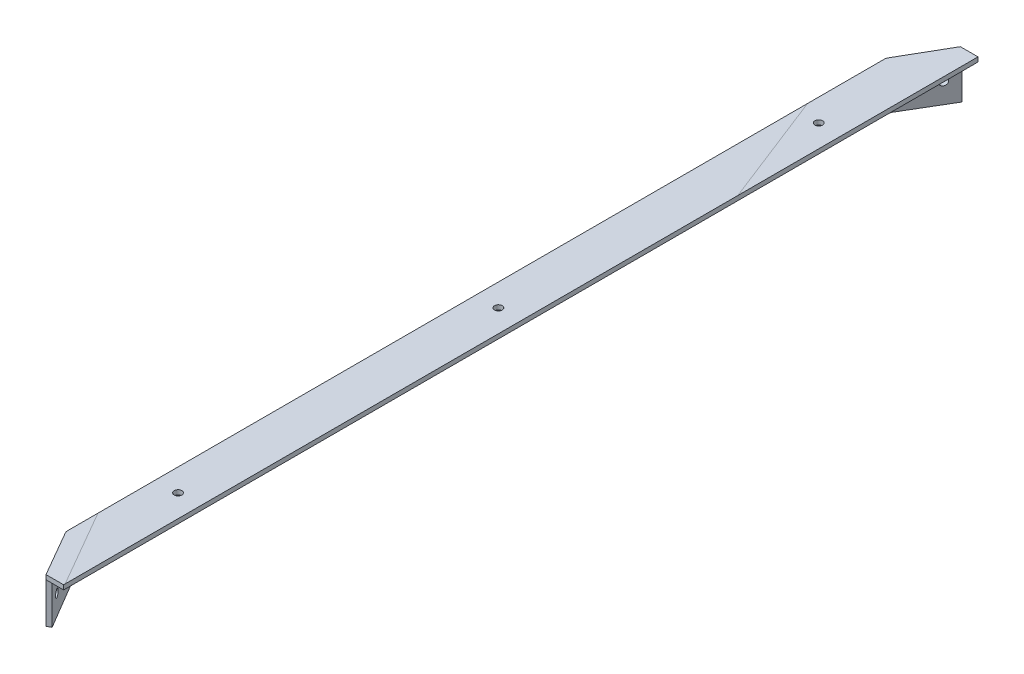
ISO-10303-21;
HEADER;
FILE_DESCRIPTION(('STEP AP214'),'2;1');
FILE_NAME('part.step','',(''),(''),'','','');
FILE_SCHEMA(('AUTOMOTIVE_DESIGN { 1 0 10303 214 1 1 1 1 }'));
ENDSEC;
DATA;
#1=APPLICATION_CONTEXT('core data for automotive mechanical design processes');
#2=APPLICATION_PROTOCOL_DEFINITION('international standard','automotive_design',2000,#1);
#3=PRODUCT_CONTEXT('',#1,'mechanical');
#4=PRODUCT('Part','Part','',(#3));
#5=PRODUCT_RELATED_PRODUCT_CATEGORY('part','',(#4));
#6=PRODUCT_DEFINITION_FORMATION('','',#4);
#7=PRODUCT_DEFINITION_CONTEXT('part definition',#1,'design');
#8=PRODUCT_DEFINITION('design','',#6,#7);
#9=PRODUCT_DEFINITION_SHAPE('','',#8);
#10=(LENGTH_UNIT() NAMED_UNIT(*) SI_UNIT(.MILLI.,.METRE.));
#11=(NAMED_UNIT(*) PLANE_ANGLE_UNIT() SI_UNIT($,.RADIAN.));
#12=(NAMED_UNIT(*) SI_UNIT($,.STERADIAN.) SOLID_ANGLE_UNIT());
#13=UNCERTAINTY_MEASURE_WITH_UNIT(LENGTH_MEASURE(1.E-05),#10,'distance_accuracy_value','');
#14=(GEOMETRIC_REPRESENTATION_CONTEXT(3) GLOBAL_UNCERTAINTY_ASSIGNED_CONTEXT((#13)) GLOBAL_UNIT_ASSIGNED_CONTEXT((#10,
#11,#12)) REPRESENTATION_CONTEXT('',''));
#15=CARTESIAN_POINT('',(0.,0.,0.));
#16=DIRECTION('',(0.,0.,1.));
#17=DIRECTION('',(1.,0.,0.));
#18=AXIS2_PLACEMENT_3D('',#15,#16,#17);
#19=CARTESIAN_POINT('',(0.,70.,640.));
#20=DIRECTION('',(0.,-1.,0.));
#21=DIRECTION('',(0.,0.,-1.));
#22=AXIS2_PLACEMENT_3D('',#19,#20,#21);
#23=PLANE('',#22);
#24=DIRECTION('',(0.,0.,-1.));
#25=VECTOR('',#24,1.);
#26=CARTESIAN_POINT('',(0.,70.,640.));
#27=LINE('',#26,#25);
#28=CARTESIAN_POINT('',(0.,70.,637.320508075689));
#29=VERTEX_POINT('',#28);
#30=CARTESIAN_POINT('',(0.,70.,590.));
#31=VERTEX_POINT('',#30);
#32=EDGE_CURVE('E283',#29,#31,#27,.T.);
#33=ORIENTED_EDGE('',*,*,#32,.F.);
#34=CARTESIAN_POINT('',(10.,70.,637.320508075689));
#35=DIRECTION('',(0.,-1.,0.));
#36=DIRECTION('',(0.,0.,-1.));
#37=AXIS2_PLACEMENT_3D('',#34,#35,#36);
#38=CIRCLE('',#37,10.);
#39=CARTESIAN_POINT('',(1.33974596215559,70.,642.320508075689));
#40=VERTEX_POINT('',#39);
#41=EDGE_CURVE('E318',#29,#40,#38,.F.);
#42=ORIENTED_EDGE('',*,*,#41,.T.);
#43=DIRECTION('',(0.5,0.,0.866025403784439));
#44=VECTOR('',#43,1.);
#45=CARTESIAN_POINT('',(0.,70.,640.));
#46=LINE('',#45,#44);
#47=CARTESIAN_POINT('',(42.5,70.,713.612159321677));
#48=VERTEX_POINT('',#47);
#49=EDGE_CURVE('E235',#40,#48,#46,.T.);
#50=ORIENTED_EDGE('',*,*,#49,.T.);
#51=DIRECTION('',(1.,0.,0.));
#52=VECTOR('',#51,1.);
#53=CARTESIAN_POINT('',(42.5,70.,713.612159321677));
#54=LINE('',#53,#52);
#55=CARTESIAN_POINT('',(70.,70.,713.612159321677));
#56=VERTEX_POINT('',#55);
#57=EDGE_CURVE('E237',#48,#56,#54,.T.);
#58=ORIENTED_EDGE('',*,*,#57,.T.);
#59=DIRECTION('',(0.,0.,-1.));
#60=VECTOR('',#59,1.);
#61=CARTESIAN_POINT('',(70.,70.,640.));
#62=LINE('',#61,#60);
#63=CARTESIAN_POINT('',(70.,70.,711.243556529821));
#64=VERTEX_POINT('',#63);
#65=EDGE_CURVE('E286',#56,#64,#62,.T.);
#66=ORIENTED_EDGE('',*,*,#65,.T.);
#67=DIRECTION('',(0.5,0.,0.866025403784439));
#68=VECTOR('',#67,1.);
#69=CARTESIAN_POINT('',(21.6506350946109,70.,627.5));
#70=LINE('',#69,#68);
#71=EDGE_CURVE('E300',#31,#64,#70,.T.);
#72=ORIENTED_EDGE('',*,*,#71,.F.);
#73=EDGE_LOOP('',(#33,#42,#50,#58,#66,#72));
#74=FACE_BOUND('',#73,.T.);
#75=ADVANCED_FACE('F47',(#74),#23,.F.);
#76=CARTESIAN_POINT('',(35.,70.,-500.));
#77=DIRECTION('',(0.,-1.,0.));
#78=DIRECTION('',(0.,0.,-1.));
#79=AXIS2_PLACEMENT_3D('',#76,#77,#78);
#80=CIRCLE('',#79,6.);
#81=CARTESIAN_POINT('',(35.,70.,-506.));
#82=VERTEX_POINT('',#81);
#83=EDGE_CURVE('E216',#82,#82,#80,.T.);
#84=ORIENTED_EDGE('',*,*,#83,.T.);
#85=EDGE_LOOP('',(#84));
#86=FACE_BOUND('',#85,.T.);
#87=DIRECTION('',(0.5,0.,-0.866025403784439));
#88=VECTOR('',#87,1.);
#89=CARTESIAN_POINT('',(0.,70.,-640.));
#90=LINE('',#89,#88);
#91=CARTESIAN_POINT('',(1.33974596215553,70.,-642.320508075689));
#92=VERTEX_POINT('',#91);
#93=CARTESIAN_POINT('',(42.5,70.,-713.612159321677));
#94=VERTEX_POINT('',#93);
#95=EDGE_CURVE('E167',#92,#94,#90,.T.);
#96=ORIENTED_EDGE('',*,*,#95,.F.);
#97=CARTESIAN_POINT('',(10.,70.,-637.320508075689));
#98=DIRECTION('',(0.,-1.,0.));
#99=DIRECTION('',(0.,0.,-1.));
#100=AXIS2_PLACEMENT_3D('',#97,#98,#99);
#101=CIRCLE('',#100,10.);
#102=CARTESIAN_POINT('',(0.,70.,-637.320508075689));
#103=VERTEX_POINT('',#102);
#104=EDGE_CURVE('E313',#92,#103,#101,.F.);
#105=ORIENTED_EDGE('',*,*,#104,.T.);
#106=CARTESIAN_POINT('',(0.,70.,-517.612159321678));
#107=VERTEX_POINT('',#106);
#108=EDGE_CURVE('E282',#107,#103,#27,.T.);
#109=ORIENTED_EDGE('',*,*,#108,.F.);
#110=DIRECTION('',(-0.364203165487799,0.,-0.931319523175944));
#111=VECTOR('',#110,1.);
#112=CARTESIAN_POINT('',(392.649910838922,70.,486.449755537852));
#113=LINE('',#112,#111);
#114=CARTESIAN_POINT('',(70.,70.,-338.612159321677));
#115=VERTEX_POINT('',#114);
#116=EDGE_CURVE('E297',#115,#107,#113,.T.);
#117=ORIENTED_EDGE('',*,*,#116,.F.);
#118=CARTESIAN_POINT('',(70.,70.,-713.612159321677));
#119=VERTEX_POINT('',#118);
#120=EDGE_CURVE('E194',#115,#119,#62,.T.);
#121=ORIENTED_EDGE('',*,*,#120,.T.);
#122=DIRECTION('',(1.,0.,0.));
#123=VECTOR('',#122,1.);
#124=CARTESIAN_POINT('',(42.5,70.,-713.612159321677));
#125=LINE('',#124,#123);
#126=EDGE_CURVE('E179',#94,#119,#125,.T.);
#127=ORIENTED_EDGE('',*,*,#126,.F.);
#128=EDGE_LOOP('',(#96,#105,#109,#117,#121,#127));
#129=FACE_BOUND('',#128,.T.);
#130=ADVANCED_FACE('F192',(#86,#129),#23,.F.);
#131=CARTESIAN_POINT('',(7.,0.,640.));
#132=DIRECTION('',(0.,1.,0.));
#133=DIRECTION('',(-1.,0.,0.));
#134=AXIS2_PLACEMENT_3D('',#131,#132,#133);
#135=PLANE('',#134);
#136=DIRECTION('',(0.,0.,-1.));
#137=VECTOR('',#136,1.);
#138=CARTESIAN_POINT('',(0.,0.,640.));
#139=LINE('',#138,#137);
#140=CARTESIAN_POINT('',(0.,0.,637.320508075689));
#141=VERTEX_POINT('',#140);
#142=CARTESIAN_POINT('',(0.,0.,-637.320508075689));
#143=VERTEX_POINT('',#142);
#144=EDGE_CURVE('E279',#141,#143,#139,.T.);
#145=ORIENTED_EDGE('',*,*,#144,.T.);
#146=CARTESIAN_POINT('',(10.,0.,-637.320508075689));
#147=DIRECTION('',(0.,1.,0.));
#148=DIRECTION('',(-1.,0.,0.));
#149=AXIS2_PLACEMENT_3D('',#146,#147,#148);
#150=CIRCLE('',#149,10.);
#151=CARTESIAN_POINT('',(1.33974596215553,0.,-642.320508075689));
#152=VERTEX_POINT('',#151);
#153=EDGE_CURVE('E310',#143,#152,#150,.F.);
#154=ORIENTED_EDGE('',*,*,#153,.T.);
#155=DIRECTION('',(0.5,0.,-0.866025403784439));
#156=VECTOR('',#155,1.);
#157=CARTESIAN_POINT('',(0.,0.,-640.));
#158=LINE('',#157,#156);
#159=CARTESIAN_POINT('',(42.5,0.,-713.612159321677));
#160=VERTEX_POINT('',#159);
#161=EDGE_CURVE('E189',#152,#160,#158,.T.);
#162=ORIENTED_EDGE('',*,*,#161,.T.);
#163=DIRECTION('',(0.866025403784443,0.,0.499999999999992));
#164=VECTOR('',#163,1.);
#165=CARTESIAN_POINT('',(42.5,0.,-713.612159321677));
#166=LINE('',#165,#164);
#167=CARTESIAN_POINT('',(48.5621778264911,0.,-710.112159321677));
#168=VERTEX_POINT('',#167);
#169=EDGE_CURVE('E209',#160,#168,#166,.T.);
#170=ORIENTED_EDGE('',*,*,#169,.T.);
#171=DIRECTION('',(-0.509931612811304,0.,0.860214944217817));
#172=VECTOR('',#171,1.);
#173=CARTESIAN_POINT('',(48.5621778264911,0.,-710.112159321677));
#174=LINE('',#173,#172);
#175=CARTESIAN_POINT('',(8.39785055782176,0.,-642.358065100126));
#176=VERTEX_POINT('',#175);
#177=EDGE_CURVE('E205',#168,#176,#174,.T.);
#178=ORIENTED_EDGE('',*,*,#177,.T.);
#179=CARTESIAN_POINT('',(17.,0.,-637.258748972013));
#180=DIRECTION('',(0.,1.,0.));
#181=DIRECTION('',(-1.,0.,0.));
#182=AXIS2_PLACEMENT_3D('',#179,#180,#181);
#183=CIRCLE('',#182,10.);
#184=CARTESIAN_POINT('',(7.,0.,-637.258748972013));
#185=VERTEX_POINT('',#184);
#186=EDGE_CURVE('E11',#176,#185,#183,.T.);
#187=ORIENTED_EDGE('',*,*,#186,.T.);
#188=DIRECTION('',(0.,0.,-1.));
#189=VECTOR('',#188,1.);
#190=CARTESIAN_POINT('',(7.,0.,640.));
#191=LINE('',#190,#189);
#192=CARTESIAN_POINT('',(7.,0.,637.258748972013));
#193=VERTEX_POINT('',#192);
#194=EDGE_CURVE('E295',#193,#185,#191,.T.);
#195=ORIENTED_EDGE('',*,*,#194,.F.);
#196=CARTESIAN_POINT('',(17.,0.,637.258748972013));
#197=DIRECTION('',(0.,1.,0.));
#198=DIRECTION('',(-1.,0.,0.));
#199=AXIS2_PLACEMENT_3D('',#196,#197,#198);
#200=CIRCLE('',#199,10.);
#201=CARTESIAN_POINT('',(8.39785055782182,0.,642.358065100127));
#202=VERTEX_POINT('',#201);
#203=EDGE_CURVE('E55',#193,#202,#200,.T.);
#204=ORIENTED_EDGE('',*,*,#203,.T.);
#205=DIRECTION('',(-0.509931612811304,0.,-0.860214944217817));
#206=VECTOR('',#205,1.);
#207=CARTESIAN_POINT('',(48.5621778264911,0.,710.112159321677));
#208=LINE('',#207,#206);
#209=CARTESIAN_POINT('',(48.5621778264911,0.,710.112159321677));
#210=VERTEX_POINT('',#209);
#211=EDGE_CURVE('E253',#210,#202,#208,.T.);
#212=ORIENTED_EDGE('',*,*,#211,.F.);
#213=DIRECTION('',(0.866025403784443,0.,-0.499999999999992));
#214=VECTOR('',#213,1.);
#215=CARTESIAN_POINT('',(42.5,0.,713.612159321677));
#216=LINE('',#215,#214);
#217=CARTESIAN_POINT('',(42.5,0.,713.612159321677));
#218=VERTEX_POINT('',#217);
#219=EDGE_CURVE('E258',#218,#210,#216,.T.);
#220=ORIENTED_EDGE('',*,*,#219,.F.);
#221=DIRECTION('',(0.5,0.,0.866025403784439));
#222=VECTOR('',#221,1.);
#223=CARTESIAN_POINT('',(0.,0.,640.));
#224=LINE('',#223,#222);
#225=CARTESIAN_POINT('',(1.33974596215559,0.,642.320508075689));
#226=VERTEX_POINT('',#225);
#227=EDGE_CURVE('E248',#226,#218,#224,.T.);
#228=ORIENTED_EDGE('',*,*,#227,.F.);
#229=CARTESIAN_POINT('',(10.,0.,637.320508075689));
#230=DIRECTION('',(0.,1.,0.));
#231=DIRECTION('',(-1.,0.,0.));
#232=AXIS2_PLACEMENT_3D('',#229,#230,#231);
#233=CIRCLE('',#232,10.);
#234=EDGE_CURVE('E308',#226,#141,#233,.F.);
#235=ORIENTED_EDGE('',*,*,#234,.T.);
#236=EDGE_LOOP('',(#145,#154,#162,#170,#178,#187,#195,#204,#212,#220,#228,#235));
#237=FACE_BOUND('',#236,.T.);
#238=ADVANCED_FACE('F334',(#237),#135,.F.);
#239=CARTESIAN_POINT('',(6.99999999999999,63.,640.));
#240=DIRECTION('',(-1.,0.,0.));
#241=DIRECTION('',(0.,-1.,0.));
#242=AXIS2_PLACEMENT_3D('',#239,#240,#241);
#243=PLANE('',#242);
#244=DIRECTION('',(0.,0.,-1.));
#245=VECTOR('',#244,1.);
#246=CARTESIAN_POINT('',(6.99999999999999,63.,640.));
#247=LINE('',#246,#245);
#248=CARTESIAN_POINT('',(6.99999999999999,63.,637.258748972013));
#249=VERTEX_POINT('',#248);
#250=CARTESIAN_POINT('',(6.99999999999999,63.,-637.258748972013));
#251=VERTEX_POINT('',#250);
#252=EDGE_CURVE('E292',#249,#251,#247,.T.);
#253=ORIENTED_EDGE('',*,*,#252,.F.);
#254=DIRECTION('',(0.,1.,0.));
#255=VECTOR('',#254,1.);
#256=CARTESIAN_POINT('',(7.,0.,637.258748972013));
#257=LINE('',#256,#255);
#258=EDGE_CURVE('E330',#249,#193,#257,.F.);
#259=ORIENTED_EDGE('',*,*,#258,.T.);
#260=ORIENTED_EDGE('',*,*,#194,.T.);
#261=DIRECTION('',(0.,1.,0.));
#262=VECTOR('',#261,1.);
#263=CARTESIAN_POINT('',(6.99999999999999,63.,-637.258748972013));
#264=LINE('',#263,#262);
#265=EDGE_CURVE('E327',#185,#251,#264,.T.);
#266=ORIENTED_EDGE('',*,*,#265,.T.);
#267=EDGE_LOOP('',(#253,#259,#260,#266));
#268=FACE_BOUND('',#267,.T.);
#269=ADVANCED_FACE('F348',(#268),#243,.F.);
#270=CARTESIAN_POINT('',(70.,63.,640.));
#271=DIRECTION('',(0.,1.,0.));
#272=DIRECTION('',(-1.,0.,0.));
#273=AXIS2_PLACEMENT_3D('',#270,#271,#272);
#274=PLANE('',#273);
#275=CARTESIAN_POINT('',(35.,63.,0.));
#276=DIRECTION('',(0.,1.,0.));
#277=DIRECTION('',(-1.,0.,0.));
#278=AXIS2_PLACEMENT_3D('',#275,#276,#277);
#279=CIRCLE('',#278,6.);
#280=CARTESIAN_POINT('',(29.,63.,0.));
#281=VERTEX_POINT('',#280);
#282=EDGE_CURVE('E273',#281,#281,#279,.T.);
#283=ORIENTED_EDGE('',*,*,#282,.T.);
#284=EDGE_LOOP('',(#283));
#285=FACE_BOUND('',#284,.T.);
#286=CARTESIAN_POINT('',(35.,63.,500.));
#287=DIRECTION('',(0.,1.,0.));
#288=DIRECTION('',(-1.,0.,0.));
#289=AXIS2_PLACEMENT_3D('',#286,#287,#288);
#290=CIRCLE('',#289,6.);
#291=CARTESIAN_POINT('',(29.,63.,500.));
#292=VERTEX_POINT('',#291);
#293=EDGE_CURVE('E276',#292,#292,#290,.T.);
#294=ORIENTED_EDGE('',*,*,#293,.T.);
#295=EDGE_LOOP('',(#294));
#296=FACE_BOUND('',#295,.T.);
#297=DIRECTION('',(-0.509931612811304,0.,-0.860214944217817));
#298=VECTOR('',#297,1.);
#299=CARTESIAN_POINT('',(48.5621778264911,63.,710.112159321677));
#300=LINE('',#299,#298);
#301=CARTESIAN_POINT('',(48.5621778264911,63.,710.112159321677));
#302=VERTEX_POINT('',#301);
#303=CARTESIAN_POINT('',(8.39785055782182,63.,642.358065100127));
#304=VERTEX_POINT('',#303);
#305=EDGE_CURVE('E252',#302,#304,#300,.T.);
#306=ORIENTED_EDGE('',*,*,#305,.T.);
#307=CARTESIAN_POINT('',(17.,63.,637.258748972013));
#308=DIRECTION('',(0.,1.,0.));
#309=DIRECTION('',(-1.,0.,0.));
#310=AXIS2_PLACEMENT_3D('',#307,#308,#309);
#311=CIRCLE('',#310,10.);
#312=EDGE_CURVE('E325',#304,#249,#311,.F.);
#313=ORIENTED_EDGE('',*,*,#312,.T.);
#314=ORIENTED_EDGE('',*,*,#252,.T.);
#315=CARTESIAN_POINT('',(17.,63.,-637.258748972013));
#316=DIRECTION('',(0.,1.,0.));
#317=DIRECTION('',(-1.,0.,0.));
#318=AXIS2_PLACEMENT_3D('',#315,#316,#317);
#319=CIRCLE('',#318,10.);
#320=CARTESIAN_POINT('',(8.39785055782176,63.,-642.358065100126));
#321=VERTEX_POINT('',#320);
#322=EDGE_CURVE('E323',#251,#321,#319,.F.);
#323=ORIENTED_EDGE('',*,*,#322,.T.);
#324=DIRECTION('',(-0.509931612811304,0.,0.860214944217817));
#325=VECTOR('',#324,1.);
#326=CARTESIAN_POINT('',(48.5621778264911,63.,-710.112159321677));
#327=LINE('',#326,#325);
#328=CARTESIAN_POINT('',(48.5621778264911,63.,-710.112159321677));
#329=VERTEX_POINT('',#328);
#330=EDGE_CURVE('E204',#329,#321,#327,.T.);
#331=ORIENTED_EDGE('',*,*,#330,.F.);
#332=DIRECTION('',(0.866025403784443,0.,0.499999999999992));
#333=VECTOR('',#332,1.);
#334=CARTESIAN_POINT('',(42.5,63.,-713.612159321677));
#335=LINE('',#334,#333);
#336=CARTESIAN_POINT('',(42.5,63.,-713.612159321677));
#337=VERTEX_POINT('',#336);
#338=EDGE_CURVE('E201',#337,#329,#335,.T.);
#339=ORIENTED_EDGE('',*,*,#338,.F.);
#340=DIRECTION('',(1.,0.,0.));
#341=VECTOR('',#340,1.);
#342=CARTESIAN_POINT('',(42.5,63.,-713.612159321677));
#343=LINE('',#342,#341);
#344=CARTESIAN_POINT('',(70.,63.,-713.612159321677));
#345=VERTEX_POINT('',#344);
#346=EDGE_CURVE('E180',#337,#345,#343,.T.);
#347=ORIENTED_EDGE('',*,*,#346,.T.);
#348=DIRECTION('',(0.,0.,-1.));
#349=VECTOR('',#348,1.);
#350=CARTESIAN_POINT('',(70.,63.,640.));
#351=LINE('',#350,#349);
#352=CARTESIAN_POINT('',(70.,63.,713.612159321677));
#353=VERTEX_POINT('',#352);
#354=EDGE_CURVE('E289',#353,#345,#351,.T.);
#355=ORIENTED_EDGE('',*,*,#354,.F.);
#356=DIRECTION('',(1.,0.,0.));
#357=VECTOR('',#356,1.);
#358=CARTESIAN_POINT('',(42.5,63.,713.612159321677));
#359=LINE('',#358,#357);
#360=CARTESIAN_POINT('',(42.5,63.,713.612159321677));
#361=VERTEX_POINT('',#360);
#362=EDGE_CURVE('E234',#361,#353,#359,.T.);
#363=ORIENTED_EDGE('',*,*,#362,.F.);
#364=DIRECTION('',(0.866025403784443,0.,-0.499999999999992));
#365=VECTOR('',#364,1.);
#366=CARTESIAN_POINT('',(42.5,63.,713.612159321677));
#367=LINE('',#366,#365);
#368=EDGE_CURVE('E249',#361,#302,#367,.T.);
#369=ORIENTED_EDGE('',*,*,#368,.T.);
#370=EDGE_LOOP('',(#306,#313,#314,#323,#331,#339,#347,#355,#363,#369));
#371=FACE_BOUND('',#370,.T.);
#372=CARTESIAN_POINT('',(35.,63.,-500.));
#373=DIRECTION('',(0.,-1.,0.));
#374=DIRECTION('',(-1.,0.,0.));
#375=AXIS2_PLACEMENT_3D('',#372,#373,#374);
#376=CIRCLE('',#375,6.);
#377=CARTESIAN_POINT('',(29.,63.,-500.));
#378=VERTEX_POINT('',#377);
#379=EDGE_CURVE('E219',#378,#378,#376,.T.);
#380=ORIENTED_EDGE('',*,*,#379,.F.);
#381=EDGE_LOOP('',(#380));
#382=FACE_BOUND('',#381,.T.);
#383=ADVANCED_FACE('F345',(#285,#296,#371,#382),#274,.F.);
#384=CARTESIAN_POINT('',(70.,70.,640.));
#385=DIRECTION('',(-1.,0.,0.));
#386=DIRECTION('',(0.,0.,1.));
#387=AXIS2_PLACEMENT_3D('',#384,#385,#386);
#388=PLANE('',#387);
#389=ORIENTED_EDGE('',*,*,#354,.T.);
#390=DIRECTION('',(0.,-1.,0.));
#391=VECTOR('',#390,1.);
#392=CARTESIAN_POINT('',(70.,70.,-713.612159321677));
#393=LINE('',#392,#391);
#394=EDGE_CURVE('E190',#119,#345,#393,.T.);
#395=ORIENTED_EDGE('',*,*,#394,.F.);
#396=ORIENTED_EDGE('',*,*,#120,.F.);
#397=EDGE_CURVE('E290',#64,#115,#62,.T.);
#398=ORIENTED_EDGE('',*,*,#397,.F.);
#399=ORIENTED_EDGE('',*,*,#65,.F.);
#400=DIRECTION('',(0.,-1.,0.));
#401=VECTOR('',#400,1.);
#402=CARTESIAN_POINT('',(70.,70.,713.612159321677));
#403=LINE('',#402,#401);
#404=EDGE_CURVE('E240',#56,#353,#403,.T.);
#405=ORIENTED_EDGE('',*,*,#404,.T.);
#406=EDGE_LOOP('',(#389,#395,#396,#398,#399,#405));
#407=FACE_BOUND('',#406,.T.);
#408=ADVANCED_FACE('F363',(#407),#388,.F.);
#409=EDGE_CURVE('E285',#31,#107,#27,.T.);
#410=ORIENTED_EDGE('',*,*,#409,.F.);
#411=ORIENTED_EDGE('',*,*,#71,.T.);
#412=ORIENTED_EDGE('',*,*,#397,.T.);
#413=ORIENTED_EDGE('',*,*,#116,.T.);
#414=EDGE_LOOP('',(#410,#411,#412,#413));
#415=FACE_BOUND('',#414,.T.);
#416=CARTESIAN_POINT('',(35.,70.,500.));
#417=DIRECTION('',(0.,1.,0.));
#418=DIRECTION('',(0.,0.,1.));
#419=AXIS2_PLACEMENT_3D('',#416,#417,#418);
#420=CIRCLE('',#419,6.);
#421=CARTESIAN_POINT('',(35.,70.,506.));
#422=VERTEX_POINT('',#421);
#423=EDGE_CURVE('E267',#422,#422,#420,.T.);
#424=ORIENTED_EDGE('',*,*,#423,.F.);
#425=EDGE_LOOP('',(#424));
#426=FACE_BOUND('',#425,.T.);
#427=CARTESIAN_POINT('',(35.,70.,0.));
#428=DIRECTION('',(0.,1.,0.));
#429=DIRECTION('',(0.,0.,1.));
#430=AXIS2_PLACEMENT_3D('',#427,#428,#429);
#431=CIRCLE('',#430,6.);
#432=CARTESIAN_POINT('',(35.,70.,6.));
#433=VERTEX_POINT('',#432);
#434=EDGE_CURVE('E270',#433,#433,#431,.T.);
#435=ORIENTED_EDGE('',*,*,#434,.F.);
#436=EDGE_LOOP('',(#435));
#437=FACE_BOUND('',#436,.T.);
#438=ADVANCED_FACE('F399',(#415,#426,#437),#23,.F.);
#439=CARTESIAN_POINT('',(0.,0.,640.));
#440=DIRECTION('',(1.,0.,0.));
#441=DIRECTION('',(0.,0.,-1.));
#442=AXIS2_PLACEMENT_3D('',#439,#440,#441);
#443=PLANE('',#442);
#444=ORIENTED_EDGE('',*,*,#108,.T.);
#445=DIRECTION('',(0.,-1.,0.));
#446=VECTOR('',#445,1.);
#447=CARTESIAN_POINT('',(0.,0.,-637.320508075689));
#448=LINE('',#447,#446);
#449=EDGE_CURVE('E305',#103,#143,#448,.T.);
#450=ORIENTED_EDGE('',*,*,#449,.T.);
#451=ORIENTED_EDGE('',*,*,#144,.F.);
#452=DIRECTION('',(0.,-1.,0.));
#453=VECTOR('',#452,1.);
#454=CARTESIAN_POINT('',(0.,0.,637.320508075689));
#455=LINE('',#454,#453);
#456=EDGE_CURVE('E303',#141,#29,#455,.F.);
#457=ORIENTED_EDGE('',*,*,#456,.T.);
#458=ORIENTED_EDGE('',*,*,#32,.T.);
#459=ORIENTED_EDGE('',*,*,#409,.T.);
#460=EDGE_LOOP('',(#444,#450,#451,#457,#458,#459));
#461=FACE_BOUND('',#460,.T.);
#462=ADVANCED_FACE('F383',(#461),#443,.F.);
#463=CARTESIAN_POINT('',(35.,60.,0.));
#464=DIRECTION('',(0.,1.,0.));
#465=DIRECTION('',(0.,0.,1.));
#466=AXIS2_PLACEMENT_3D('',#463,#464,#465);
#467=CYLINDRICAL_SURFACE('',#466,6.);
#468=ORIENTED_EDGE('',*,*,#434,.T.);
#469=EDGE_LOOP('',(#468));
#470=FACE_BOUND('',#469,.T.);
#471=ORIENTED_EDGE('',*,*,#282,.F.);
#472=EDGE_LOOP('',(#471));
#473=FACE_BOUND('',#472,.T.);
#474=ADVANCED_FACE('F412',(#470,#473),#467,.F.);
#475=CARTESIAN_POINT('',(35.,60.,500.));
#476=DIRECTION('',(0.,1.,0.));
#477=DIRECTION('',(0.,0.,1.));
#478=AXIS2_PLACEMENT_3D('',#475,#476,#477);
#479=CYLINDRICAL_SURFACE('',#478,6.);
#480=ORIENTED_EDGE('',*,*,#423,.T.);
#481=EDGE_LOOP('',(#480));
#482=FACE_BOUND('',#481,.T.);
#483=ORIENTED_EDGE('',*,*,#293,.F.);
#484=EDGE_LOOP('',(#483));
#485=FACE_BOUND('',#484,.T.);
#486=ADVANCED_FACE('F422',(#482,#485),#479,.F.);
#487=CARTESIAN_POINT('',(0.,63.,640.));
#488=DIRECTION('',(0.866025403784439,0.,-0.5));
#489=DIRECTION('',(-0.5,0.,-0.866025403784439));
#490=AXIS2_PLACEMENT_3D('',#487,#488,#489);
#491=PLANE('',#490);
#492=CARTESIAN_POINT('',(31.9145711589444,31.5,695.277658749064));
#493=DIRECTION('',(0.866025403784439,0.,-0.5));
#494=DIRECTION('',(-0.5,0.,-0.866025403784439));
#495=AXIS2_PLACEMENT_3D('',#492,#493,#494);
#496=ELLIPSE('',#495,6.00039722141594,5.99999999999998);
#497=CARTESIAN_POINT('',(28.9143725482365,31.5,690.08116232252));
#498=VERTEX_POINT('',#497);
#499=EDGE_CURVE('E231',#498,#498,#496,.T.);
#500=ORIENTED_EDGE('',*,*,#499,.T.);
#501=EDGE_LOOP('',(#500));
#502=FACE_BOUND('',#501,.T.);
#503=CARTESIAN_POINT('',(12.4155825463067,31.5,661.504419775769));
#504=DIRECTION('',(0.866025403784439,0.,-0.5));
#505=DIRECTION('',(-0.5,0.,-0.866025403784439));
#506=AXIS2_PLACEMENT_3D('',#503,#504,#505);
#507=ELLIPSE('',#506,6.00039722141594,5.99999999999998);
#508=CARTESIAN_POINT('',(9.41538393559871,31.5,656.307923349225));
#509=VERTEX_POINT('',#508);
#510=EDGE_CURVE('E226',#509,#509,#507,.T.);
#511=ORIENTED_EDGE('',*,*,#510,.T.);
#512=EDGE_LOOP('',(#511));
#513=FACE_BOUND('',#512,.T.);
#514=ORIENTED_EDGE('',*,*,#49,.F.);
#515=DIRECTION('',(0.,-1.,0.));
#516=VECTOR('',#515,1.);
#517=CARTESIAN_POINT('',(1.33974596215559,63.,642.320508075689));
#518=LINE('',#517,#516);
#519=EDGE_CURVE('E315',#40,#226,#518,.T.);
#520=ORIENTED_EDGE('',*,*,#519,.T.);
#521=ORIENTED_EDGE('',*,*,#227,.T.);
#522=DIRECTION('',(0.,-1.,0.));
#523=VECTOR('',#522,1.);
#524=CARTESIAN_POINT('',(42.5,63.,713.612159321677));
#525=LINE('',#524,#523);
#526=EDGE_CURVE('E264',#361,#218,#525,.T.);
#527=ORIENTED_EDGE('',*,*,#526,.F.);
#528=DIRECTION('',(0.,-1.,0.));
#529=VECTOR('',#528,1.);
#530=CARTESIAN_POINT('',(42.5,70.,713.612159321677));
#531=LINE('',#530,#529);
#532=EDGE_CURVE('E245',#48,#361,#531,.T.);
#533=ORIENTED_EDGE('',*,*,#532,.F.);
#534=EDGE_LOOP('',(#514,#520,#521,#527,#533));
#535=FACE_BOUND('',#534,.T.);
#536=ADVANCED_FACE('F374',(#502,#513,#535),#491,.F.);
#537=CARTESIAN_POINT('',(42.5,63.,713.612159321677));
#538=DIRECTION('',(-0.499999999999992,0.,-0.866025403784443));
#539=DIRECTION('',(-0.866025403784443,0.,0.499999999999992));
#540=AXIS2_PLACEMENT_3D('',#537,#538,#539);
#541=PLANE('',#540);
#542=ORIENTED_EDGE('',*,*,#219,.T.);
#543=DIRECTION('',(0.,-1.,0.));
#544=VECTOR('',#543,1.);
#545=CARTESIAN_POINT('',(48.5621778264911,63.,710.112159321677));
#546=LINE('',#545,#544);
#547=EDGE_CURVE('E256',#302,#210,#546,.T.);
#548=ORIENTED_EDGE('',*,*,#547,.F.);
#549=ORIENTED_EDGE('',*,*,#368,.F.);
#550=ORIENTED_EDGE('',*,*,#526,.T.);
#551=EDGE_LOOP('',(#542,#548,#549,#550));
#552=FACE_BOUND('',#551,.T.);
#553=ADVANCED_FACE('F377',(#552),#541,.F.);
#554=CARTESIAN_POINT('',(48.5621778264911,63.,710.112159321677));
#555=DIRECTION('',(-0.860214944217817,0.,0.509931612811304));
#556=DIRECTION('',(0.509931612811304,0.,0.860214944217817));
#557=AXIS2_PLACEMENT_3D('',#554,#555,#556);
#558=PLANE('',#557);
#559=CARTESIAN_POINT('',(37.7261310542509,31.5,691.832591757049));
#560=DIRECTION('',(0.860214944217817,0.,-0.509931612811304));
#561=DIRECTION('',(-0.509931612811304,0.,-0.860214944217817));
#562=AXIS2_PLACEMENT_3D('',#559,#560,#561);
#563=CIRCLE('',#562,5.99999999999998);
#564=CARTESIAN_POINT('',(34.6665413773831,31.5,686.671302091742));
#565=VERTEX_POINT('',#564);
#566=EDGE_CURVE('E223',#565,#565,#563,.T.);
#567=ORIENTED_EDGE('',*,*,#566,.F.);
#568=EDGE_LOOP('',(#567));
#569=FACE_BOUND('',#568,.T.);
#570=CARTESIAN_POINT('',(17.8411460883683,31.5,658.288169714071));
#571=DIRECTION('',(0.860214944217817,0.,-0.509931612811304));
#572=DIRECTION('',(-0.509931612811304,0.,-0.860214944217817));
#573=AXIS2_PLACEMENT_3D('',#570,#571,#572);
#574=CIRCLE('',#573,5.99999999999998);
#575=CARTESIAN_POINT('',(14.7815564115005,31.5,653.126880048764));
#576=VERTEX_POINT('',#575);
#577=EDGE_CURVE('E222',#576,#576,#574,.T.);
#578=ORIENTED_EDGE('',*,*,#577,.F.);
#579=EDGE_LOOP('',(#578));
#580=FACE_BOUND('',#579,.T.);
#581=ORIENTED_EDGE('',*,*,#211,.T.);
#582=DIRECTION('',(0.,1.,0.));
#583=VECTOR('',#582,1.);
#584=CARTESIAN_POINT('',(8.39785055782181,63.,642.358065100127));
#585=LINE('',#584,#583);
#586=EDGE_CURVE('E320',#202,#304,#585,.T.);
#587=ORIENTED_EDGE('',*,*,#586,.T.);
#588=ORIENTED_EDGE('',*,*,#305,.F.);
#589=ORIENTED_EDGE('',*,*,#547,.T.);
#590=EDGE_LOOP('',(#581,#587,#588,#589));
#591=FACE_BOUND('',#590,.T.);
#592=ADVANCED_FACE('F340',(#569,#580,#591),#558,.F.);
#593=CARTESIAN_POINT('',(42.5,70.,713.612159321677));
#594=DIRECTION('',(0.,0.,-1.));
#595=DIRECTION('',(-1.,0.,0.));
#596=AXIS2_PLACEMENT_3D('',#593,#594,#595);
#597=PLANE('',#596);
#598=ORIENTED_EDGE('',*,*,#362,.T.);
#599=ORIENTED_EDGE('',*,*,#404,.F.);
#600=ORIENTED_EDGE('',*,*,#57,.F.);
#601=ORIENTED_EDGE('',*,*,#532,.T.);
#602=EDGE_LOOP('',(#598,#599,#600,#601));
#603=FACE_BOUND('',#602,.T.);
#604=ADVANCED_FACE('F360',(#603),#597,.F.);
#605=CARTESIAN_POINT('',(11.8196414788436,31.5,661.85769100375));
#606=DIRECTION('',(0.860214944217817,0.,-0.509931612811304));
#607=DIRECTION('',(-0.509931612811304,0.,-0.860214944217817));
#608=AXIS2_PLACEMENT_3D('',#605,#606,#607);
#609=CYLINDRICAL_SURFACE('',#608,5.99999999999998);
#610=ORIENTED_EDGE('',*,*,#577,.T.);
#611=EDGE_LOOP('',(#610));
#612=FACE_BOUND('',#611,.T.);
#613=ORIENTED_EDGE('',*,*,#510,.F.);
#614=EDGE_LOOP('',(#613));
#615=FACE_BOUND('',#614,.T.);
#616=ADVANCED_FACE('F449',(#612,#615),#609,.F.);
#617=CARTESIAN_POINT('',(31.7046264447262,31.5,695.402113046728));
#618=DIRECTION('',(0.860214944217817,0.,-0.509931612811304));
#619=DIRECTION('',(-0.509931612811304,0.,-0.860214944217817));
#620=AXIS2_PLACEMENT_3D('',#617,#618,#619);
#621=CYLINDRICAL_SURFACE('',#620,5.99999999999998);
#622=ORIENTED_EDGE('',*,*,#566,.T.);
#623=EDGE_LOOP('',(#622));
#624=FACE_BOUND('',#623,.T.);
#625=ORIENTED_EDGE('',*,*,#499,.F.);
#626=EDGE_LOOP('',(#625));
#627=FACE_BOUND('',#626,.T.);
#628=ADVANCED_FACE('F452',(#624,#627),#621,.F.);
#629=CARTESIAN_POINT('',(35.,60.,-500.));
#630=DIRECTION('',(0.,1.,0.));
#631=DIRECTION('',(0.,0.,-1.));
#632=AXIS2_PLACEMENT_3D('',#629,#630,#631);
#633=CYLINDRICAL_SURFACE('',#632,6.);
#634=ORIENTED_EDGE('',*,*,#83,.F.);
#635=EDGE_LOOP('',(#634));
#636=FACE_BOUND('',#635,.T.);
#637=ORIENTED_EDGE('',*,*,#379,.T.);
#638=EDGE_LOOP('',(#637));
#639=FACE_BOUND('',#638,.T.);
#640=ADVANCED_FACE('F456',(#636,#639),#633,.F.);
#641=CARTESIAN_POINT('',(0.,63.,-640.));
#642=DIRECTION('',(0.866025403784439,0.,0.5));
#643=DIRECTION('',(-0.5,0.,0.866025403784439));
#644=AXIS2_PLACEMENT_3D('',#641,#642,#643);
#645=PLANE('',#644);
#646=CARTESIAN_POINT('',(31.9145711589444,31.5,-695.277658749064));
#647=DIRECTION('',(-0.866025403784439,0.,-0.5));
#648=DIRECTION('',(-0.5,0.,0.866025403784439));
#649=AXIS2_PLACEMENT_3D('',#646,#647,#648);
#650=ELLIPSE('',#649,6.00039722141594,5.99999999999998);
#651=CARTESIAN_POINT('',(28.9143725482365,31.5,-690.08116232252));
#652=VERTEX_POINT('',#651);
#653=EDGE_CURVE('E199',#652,#652,#650,.T.);
#654=ORIENTED_EDGE('',*,*,#653,.F.);
#655=EDGE_LOOP('',(#654));
#656=FACE_BOUND('',#655,.T.);
#657=CARTESIAN_POINT('',(12.4155825463067,31.5,-661.504419775769));
#658=DIRECTION('',(-0.866025403784439,0.,-0.5));
#659=DIRECTION('',(-0.5,0.,0.866025403784439));
#660=AXIS2_PLACEMENT_3D('',#657,#658,#659);
#661=ELLIPSE('',#660,6.00039722141594,5.99999999999998);
#662=CARTESIAN_POINT('',(9.41538393559871,31.5,-656.307923349225));
#663=VERTEX_POINT('',#662);
#664=EDGE_CURVE('E485',#663,#663,#661,.T.);
#665=ORIENTED_EDGE('',*,*,#664,.F.);
#666=EDGE_LOOP('',(#665));
#667=FACE_BOUND('',#666,.T.);
#668=ORIENTED_EDGE('',*,*,#161,.F.);
#669=DIRECTION('',(0.,-1.,0.));
#670=VECTOR('',#669,1.);
#671=CARTESIAN_POINT('',(1.33974596215553,63.,-642.320508075689));
#672=LINE('',#671,#670);
#673=EDGE_CURVE('E175',#152,#92,#672,.F.);
#674=ORIENTED_EDGE('',*,*,#673,.T.);
#675=ORIENTED_EDGE('',*,*,#95,.T.);
#676=DIRECTION('',(0.,-1.,0.));
#677=VECTOR('',#676,1.);
#678=CARTESIAN_POINT('',(42.5,70.,-713.612159321677));
#679=LINE('',#678,#677);
#680=EDGE_CURVE('E172',#94,#337,#679,.T.);
#681=ORIENTED_EDGE('',*,*,#680,.T.);
#682=DIRECTION('',(0.,-1.,0.));
#683=VECTOR('',#682,1.);
#684=CARTESIAN_POINT('',(42.5,63.,-713.612159321677));
#685=LINE('',#684,#683);
#686=EDGE_CURVE('E214',#337,#160,#685,.T.);
#687=ORIENTED_EDGE('',*,*,#686,.T.);
#688=EDGE_LOOP('',(#668,#674,#675,#681,#687));
#689=FACE_BOUND('',#688,.T.);
#690=ADVANCED_FACE('F170',(#656,#667,#689),#645,.F.);
#691=CARTESIAN_POINT('',(42.5,63.,-713.612159321677));
#692=DIRECTION('',(-0.499999999999992,0.,0.866025403784443));
#693=DIRECTION('',(-0.866025403784443,0.,-0.499999999999992));
#694=AXIS2_PLACEMENT_3D('',#691,#692,#693);
#695=PLANE('',#694);
#696=ORIENTED_EDGE('',*,*,#169,.F.);
#697=ORIENTED_EDGE('',*,*,#686,.F.);
#698=ORIENTED_EDGE('',*,*,#338,.T.);
#699=DIRECTION('',(0.,-1.,0.));
#700=VECTOR('',#699,1.);
#701=CARTESIAN_POINT('',(48.5621778264911,63.,-710.112159321677));
#702=LINE('',#701,#700);
#703=EDGE_CURVE('E207',#329,#168,#702,.T.);
#704=ORIENTED_EDGE('',*,*,#703,.T.);
#705=EDGE_LOOP('',(#696,#697,#698,#704));
#706=FACE_BOUND('',#705,.T.);
#707=ADVANCED_FACE('F355',(#706),#695,.F.);
#708=CARTESIAN_POINT('',(48.5621778264911,63.,-710.112159321677));
#709=DIRECTION('',(-0.860214944217817,0.,-0.509931612811304));
#710=DIRECTION('',(0.509931612811304,0.,-0.860214944217817));
#711=AXIS2_PLACEMENT_3D('',#708,#709,#710);
#712=PLANE('',#711);
#713=CARTESIAN_POINT('',(37.7261310542509,31.5,-691.832591757049));
#714=DIRECTION('',(-0.860214944217817,0.,-0.509931612811304));
#715=DIRECTION('',(-0.509931612811304,0.,0.860214944217817));
#716=AXIS2_PLACEMENT_3D('',#713,#714,#715);
#717=CIRCLE('',#716,5.99999999999998);
#718=CARTESIAN_POINT('',(34.6665413773831,31.5,-686.671302091742));
#719=VERTEX_POINT('',#718);
#720=EDGE_CURVE('E482',#719,#719,#717,.T.);
#721=ORIENTED_EDGE('',*,*,#720,.T.);
#722=EDGE_LOOP('',(#721));
#723=FACE_BOUND('',#722,.T.);
#724=CARTESIAN_POINT('',(17.8411460883683,31.5,-658.288169714071));
#725=DIRECTION('',(-0.860214944217817,0.,-0.509931612811304));
#726=DIRECTION('',(-0.509931612811304,0.,0.860214944217817));
#727=AXIS2_PLACEMENT_3D('',#724,#725,#726);
#728=CIRCLE('',#727,5.99999999999998);
#729=CARTESIAN_POINT('',(14.7815564115005,31.5,-653.126880048764));
#730=VERTEX_POINT('',#729);
#731=EDGE_CURVE('E489',#730,#730,#728,.T.);
#732=ORIENTED_EDGE('',*,*,#731,.T.);
#733=EDGE_LOOP('',(#732));
#734=FACE_BOUND('',#733,.T.);
#735=ORIENTED_EDGE('',*,*,#330,.T.);
#736=DIRECTION('',(0.,1.,0.));
#737=VECTOR('',#736,1.);
#738=CARTESIAN_POINT('',(8.39785055782175,0.,-642.358065100126));
#739=LINE('',#738,#737);
#740=EDGE_CURVE('E62',#321,#176,#739,.F.);
#741=ORIENTED_EDGE('',*,*,#740,.T.);
#742=ORIENTED_EDGE('',*,*,#177,.F.);
#743=ORIENTED_EDGE('',*,*,#703,.F.);
#744=EDGE_LOOP('',(#735,#741,#742,#743));
#745=FACE_BOUND('',#744,.T.);
#746=ADVANCED_FACE('F352',(#723,#734,#745),#712,.F.);
#747=CARTESIAN_POINT('',(42.5,70.,-713.612159321677));
#748=DIRECTION('',(0.,0.,1.));
#749=DIRECTION('',(-1.,0.,0.));
#750=AXIS2_PLACEMENT_3D('',#747,#748,#749);
#751=PLANE('',#750);
#752=ORIENTED_EDGE('',*,*,#346,.F.);
#753=ORIENTED_EDGE('',*,*,#680,.F.);
#754=ORIENTED_EDGE('',*,*,#126,.T.);
#755=ORIENTED_EDGE('',*,*,#394,.T.);
#756=EDGE_LOOP('',(#752,#753,#754,#755));
#757=FACE_BOUND('',#756,.T.);
#758=ADVANCED_FACE('F184',(#757),#751,.F.);
#759=CARTESIAN_POINT('',(11.8196414788436,31.5,-661.85769100375));
#760=DIRECTION('',(0.860214944217817,0.,0.509931612811304));
#761=DIRECTION('',(-0.509931612811304,0.,0.860214944217817));
#762=AXIS2_PLACEMENT_3D('',#759,#760,#761);
#763=CYLINDRICAL_SURFACE('',#762,5.99999999999998);
#764=ORIENTED_EDGE('',*,*,#731,.F.);
#765=EDGE_LOOP('',(#764));
#766=FACE_BOUND('',#765,.T.);
#767=ORIENTED_EDGE('',*,*,#664,.T.);
#768=EDGE_LOOP('',(#767));
#769=FACE_BOUND('',#768,.T.);
#770=ADVANCED_FACE('F471',(#766,#769),#763,.F.);
#771=CARTESIAN_POINT('',(31.7046264447262,31.5,-695.402113046728));
#772=DIRECTION('',(0.860214944217817,0.,0.509931612811304));
#773=DIRECTION('',(-0.509931612811304,0.,0.860214944217817));
#774=AXIS2_PLACEMENT_3D('',#771,#772,#773);
#775=CYLINDRICAL_SURFACE('',#774,5.99999999999998);
#776=ORIENTED_EDGE('',*,*,#720,.F.);
#777=EDGE_LOOP('',(#776));
#778=FACE_BOUND('',#777,.T.);
#779=ORIENTED_EDGE('',*,*,#653,.T.);
#780=EDGE_LOOP('',(#779));
#781=FACE_BOUND('',#780,.T.);
#782=ADVANCED_FACE('F394',(#778,#781),#775,.F.);
#783=CARTESIAN_POINT('',(10.,0.,-637.320508075689));
#784=DIRECTION('',(0.,-1.,0.));
#785=DIRECTION('',(0.,0.,-1.));
#786=AXIS2_PLACEMENT_3D('',#783,#784,#785);
#787=CYLINDRICAL_SURFACE('',#786,10.);
#788=ORIENTED_EDGE('',*,*,#104,.F.);
#789=ORIENTED_EDGE('',*,*,#673,.F.);
#790=ORIENTED_EDGE('',*,*,#153,.F.);
#791=ORIENTED_EDGE('',*,*,#449,.F.);
#792=EDGE_LOOP('',(#788,#789,#790,#791));
#793=FACE_BOUND('',#792,.T.);
#794=ADVANCED_FACE('F387',(#793),#787,.T.);
#795=CARTESIAN_POINT('',(10.,63.,637.320508075689));
#796=DIRECTION('',(0.,-1.,0.));
#797=DIRECTION('',(0.,0.,-1.));
#798=AXIS2_PLACEMENT_3D('',#795,#796,#797);
#799=CYLINDRICAL_SURFACE('',#798,10.);
#800=ORIENTED_EDGE('',*,*,#41,.F.);
#801=ORIENTED_EDGE('',*,*,#456,.F.);
#802=ORIENTED_EDGE('',*,*,#234,.F.);
#803=ORIENTED_EDGE('',*,*,#519,.F.);
#804=EDGE_LOOP('',(#800,#801,#802,#803));
#805=FACE_BOUND('',#804,.T.);
#806=ADVANCED_FACE('F385',(#805),#799,.T.);
#807=CARTESIAN_POINT('',(17.,63.,637.258748972013));
#808=DIRECTION('',(0.,-1.,0.));
#809=DIRECTION('',(0.,0.,-1.));
#810=AXIS2_PLACEMENT_3D('',#807,#808,#809);
#811=CYLINDRICAL_SURFACE('',#810,10.);
#812=ORIENTED_EDGE('',*,*,#203,.F.);
#813=ORIENTED_EDGE('',*,*,#258,.F.);
#814=ORIENTED_EDGE('',*,*,#312,.F.);
#815=ORIENTED_EDGE('',*,*,#586,.F.);
#816=EDGE_LOOP('',(#812,#813,#814,#815));
#817=FACE_BOUND('',#816,.T.);
#818=ADVANCED_FACE('F342',(#817),#811,.F.);
#819=CARTESIAN_POINT('',(17.,63.0000000000002,-637.258748972013));
#820=DIRECTION('',(0.,-1.,0.));
#821=DIRECTION('',(0.,0.,-1.));
#822=AXIS2_PLACEMENT_3D('',#819,#820,#821);
#823=CYLINDRICAL_SURFACE('',#822,10.);
#824=ORIENTED_EDGE('',*,*,#186,.F.);
#825=ORIENTED_EDGE('',*,*,#740,.F.);
#826=ORIENTED_EDGE('',*,*,#322,.F.);
#827=ORIENTED_EDGE('',*,*,#265,.F.);
#828=EDGE_LOOP('',(#824,#825,#826,#827));
#829=FACE_BOUND('',#828,.T.);
#830=ADVANCED_FACE('F49',(#829),#823,.F.);
#831=CLOSED_SHELL('',(#75,#130,#238,#269,#383,#408,#438,#462,#474,#486,#536,#553,#592,#604,#616,
#628,#640,#690,#707,#746,#758,#770,#782,#794,#806,#818,#830));
#832=MANIFOLD_SOLID_BREP('B2',#831);
#833=ADVANCED_BREP_SHAPE_REPRESENTATION('',(#18,#832),#14);
#834=SHAPE_DEFINITION_REPRESENTATION(#9,#833);
ENDSEC;
END-ISO-10303-21;
